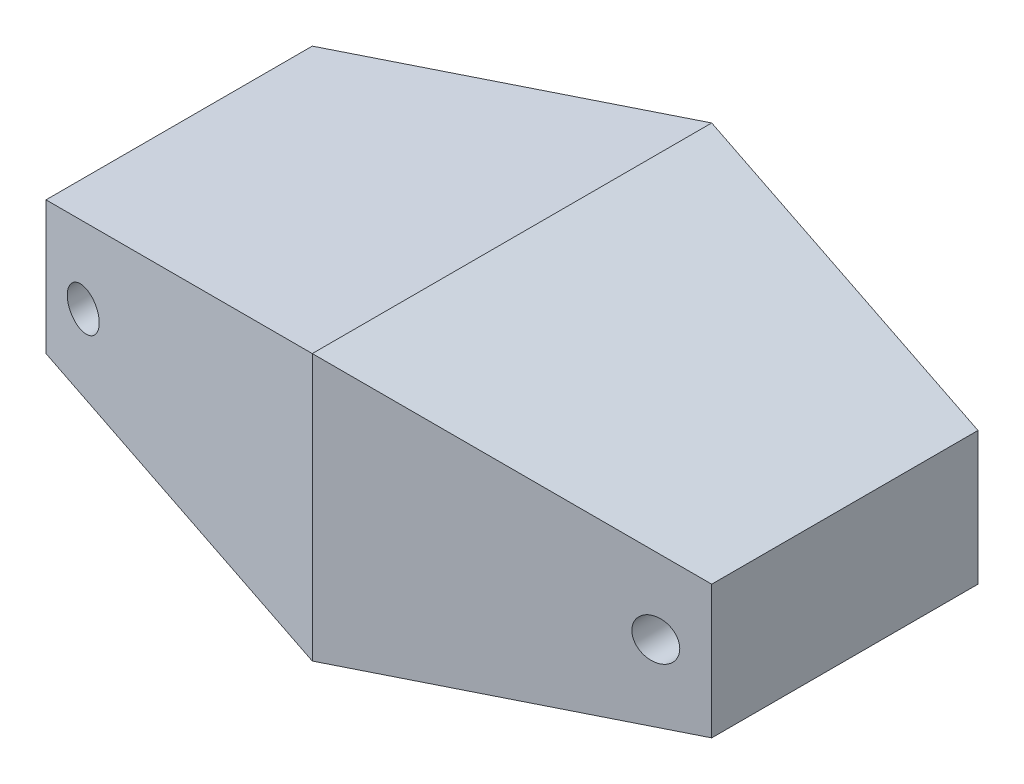
ISO-10303-21;
HEADER;
FILE_DESCRIPTION(('STEP AP214'),'2;1');
FILE_NAME('part.step','',(''),(''),'','','');
FILE_SCHEMA(('AUTOMOTIVE_DESIGN { 1 0 10303 214 1 1 1 1 }'));
ENDSEC;
DATA;
#1=APPLICATION_CONTEXT('core data for automotive mechanical design processes');
#2=APPLICATION_PROTOCOL_DEFINITION('international standard','automotive_design',2000,#1);
#3=PRODUCT_CONTEXT('',#1,'mechanical');
#4=PRODUCT('Part','Part','',(#3));
#5=PRODUCT_RELATED_PRODUCT_CATEGORY('part','',(#4));
#6=PRODUCT_DEFINITION_FORMATION('','',#4);
#7=PRODUCT_DEFINITION_CONTEXT('part definition',#1,'design');
#8=PRODUCT_DEFINITION('design','',#6,#7);
#9=PRODUCT_DEFINITION_SHAPE('','',#8);
#10=(LENGTH_UNIT() NAMED_UNIT(*) SI_UNIT(.MILLI.,.METRE.));
#11=(NAMED_UNIT(*) PLANE_ANGLE_UNIT() SI_UNIT($,.RADIAN.));
#12=(NAMED_UNIT(*) SI_UNIT($,.STERADIAN.) SOLID_ANGLE_UNIT());
#13=UNCERTAINTY_MEASURE_WITH_UNIT(LENGTH_MEASURE(1.E-05),#10,'distance_accuracy_value','');
#14=(GEOMETRIC_REPRESENTATION_CONTEXT(3) GLOBAL_UNCERTAINTY_ASSIGNED_CONTEXT((#13)) GLOBAL_UNIT_ASSIGNED_CONTEXT((#10,
#11,#12)) REPRESENTATION_CONTEXT('',''));
#15=CARTESIAN_POINT('',(0.,0.,0.));
#16=DIRECTION('',(0.,0.,1.));
#17=DIRECTION('',(1.,0.,0.));
#18=AXIS2_PLACEMENT_3D('',#15,#16,#17);
#19=CARTESIAN_POINT('',(50.,-20.,60.));
#20=DIRECTION('',(-1.,0.,0.));
#21=DIRECTION('',(0.,0.,1.));
#22=AXIS2_PLACEMENT_3D('',#19,#20,#21);
#23=PLANE('',#22);
#24=DIRECTION('',(0.,0.,-1.));
#25=VECTOR('',#24,1.);
#26=CARTESIAN_POINT('',(50.0000000000001,9.9999999999999,60.));
#27=LINE('',#26,#25);
#28=CARTESIAN_POINT('',(50.,9.9999999999999,50.));
#29=VERTEX_POINT('',#28);
#30=CARTESIAN_POINT('',(50.0000000000001,9.9999999999999,10.));
#31=VERTEX_POINT('',#30);
#32=EDGE_CURVE('E189',#29,#31,#27,.T.);
#33=ORIENTED_EDGE('',*,*,#32,.F.);
#34=DIRECTION('',(0.,1.,0.));
#35=VECTOR('',#34,1.);
#36=CARTESIAN_POINT('',(50.,-20.,50.));
#37=LINE('',#36,#35);
#38=CARTESIAN_POINT('',(50.0000000000001,-9.9999999999999,50.));
#39=VERTEX_POINT('',#38);
#40=EDGE_CURVE('E146',#39,#29,#37,.T.);
#41=ORIENTED_EDGE('',*,*,#40,.F.);
#42=DIRECTION('',(0.,0.,-1.));
#43=VECTOR('',#42,1.);
#44=CARTESIAN_POINT('',(50.0000000000001,-9.9999999999999,60.));
#45=LINE('',#44,#43);
#46=CARTESIAN_POINT('',(50.,-9.99999999999989,10.));
#47=VERTEX_POINT('',#46);
#48=EDGE_CURVE('E192',#39,#47,#45,.T.);
#49=ORIENTED_EDGE('',*,*,#48,.T.);
#50=DIRECTION('',(0.,1.,0.));
#51=VECTOR('',#50,1.);
#52=CARTESIAN_POINT('',(50.,-20.,10.));
#53=LINE('',#52,#51);
#54=EDGE_CURVE('E165',#47,#31,#53,.T.);
#55=ORIENTED_EDGE('',*,*,#54,.T.);
#56=EDGE_LOOP('',(#33,#41,#49,#55));
#57=FACE_BOUND('',#56,.T.);
#58=ADVANCED_FACE('F74',(#57),#23,.F.);
#59=CARTESIAN_POINT('',(11.5384615384616,-20.,57.6923076923077));
#60=DIRECTION('',(-0.196116135138184,0.,-0.98058067569092));
#61=DIRECTION('',(-0.98058067569092,0.,0.196116135138184));
#62=AXIS2_PLACEMENT_3D('',#59,#60,#61);
#63=PLANE('',#62);
#64=CARTESIAN_POINT('',(43.,0.,51.4));
#65=DIRECTION('',(-0.196116135138184,0.,-0.98058067569092));
#66=DIRECTION('',(0.98058067569092,0.,-0.196116135138184));
#67=AXIS2_PLACEMENT_3D('',#64,#65,#66);
#68=ELLIPSE('',#67,3.05941170815567,3.);
#69=CARTESIAN_POINT('',(46.,0.,50.8));
#70=VERTEX_POINT('',#69);
#71=EDGE_CURVE('E183',#70,#70,#68,.F.);
#72=ORIENTED_EDGE('',*,*,#71,.F.);
#73=EDGE_LOOP('',(#72));
#74=FACE_BOUND('',#73,.T.);
#75=DIRECTION('',(0.962250448649376,-0.192450089729877,-0.192450089729875));
#76=VECTOR('',#75,1.);
#77=CARTESIAN_POINT('',(18.5185185185186,16.2962962962963,56.2962962962963));
#78=LINE('',#77,#76);
#79=CARTESIAN_POINT('',(0.,20.,60.));
#80=VERTEX_POINT('',#79);
#81=EDGE_CURVE('E131',#80,#29,#78,.T.);
#82=ORIENTED_EDGE('',*,*,#81,.F.);
#83=DIRECTION('',(0.,1.,0.));
#84=VECTOR('',#83,1.);
#85=CARTESIAN_POINT('',(0.,-20.,60.));
#86=LINE('',#85,#84);
#87=CARTESIAN_POINT('',(0.,-20.,60.));
#88=VERTEX_POINT('',#87);
#89=EDGE_CURVE('E144',#88,#80,#86,.T.);
#90=ORIENTED_EDGE('',*,*,#89,.F.);
#91=DIRECTION('',(0.962250448649376,0.192450089729877,-0.192450089729875));
#92=VECTOR('',#91,1.);
#93=CARTESIAN_POINT('',(11.1111111111111,-17.7777777777778,57.7777777777778));
#94=LINE('',#93,#92);
#95=EDGE_CURVE('E98',#88,#39,#94,.T.);
#96=ORIENTED_EDGE('',*,*,#95,.T.);
#97=ORIENTED_EDGE('',*,*,#40,.T.);
#98=EDGE_LOOP('',(#82,#90,#96,#97));
#99=FACE_BOUND('',#98,.T.);
#100=ADVANCED_FACE('F142',(#74,#99),#63,.F.);
#101=CARTESIAN_POINT('',(0.,-20.,0.));
#102=DIRECTION('',(0.196116135138184,0.,-0.98058067569092));
#103=DIRECTION('',(-0.98058067569092,0.,-0.196116135138184));
#104=AXIS2_PLACEMENT_3D('',#101,#102,#103);
#105=PLANE('',#104);
#106=CARTESIAN_POINT('',(43.,0.,8.6));
#107=DIRECTION('',(0.196116135138184,0.,-0.98058067569092));
#108=DIRECTION('',(-0.98058067569092,0.,-0.196116135138184));
#109=AXIS2_PLACEMENT_3D('',#106,#107,#108);
#110=ELLIPSE('',#109,3.05941170815567,3.);
#111=CARTESIAN_POINT('',(40.,0.,8.));
#112=VERTEX_POINT('',#111);
#113=EDGE_CURVE('E77',#112,#112,#110,.F.);
#114=ORIENTED_EDGE('',*,*,#113,.T.);
#115=EDGE_LOOP('',(#114));
#116=FACE_BOUND('',#115,.T.);
#117=DIRECTION('',(0.,1.,0.));
#118=VECTOR('',#117,1.);
#119=CARTESIAN_POINT('',(0.,-20.,0.));
#120=LINE('',#119,#118);
#121=CARTESIAN_POINT('',(0.,-20.,0.));
#122=VERTEX_POINT('',#121);
#123=CARTESIAN_POINT('',(0.,20.,0.));
#124=VERTEX_POINT('',#123);
#125=EDGE_CURVE('E216',#122,#124,#120,.T.);
#126=ORIENTED_EDGE('',*,*,#125,.T.);
#127=DIRECTION('',(0.962250448649376,-0.192450089729877,0.192450089729875));
#128=VECTOR('',#127,1.);
#129=CARTESIAN_POINT('',(7.40740740740748,18.5185185185185,1.4814814814815));
#130=LINE('',#129,#128);
#131=EDGE_CURVE('E134',#124,#31,#130,.T.);
#132=ORIENTED_EDGE('',*,*,#131,.T.);
#133=ORIENTED_EDGE('',*,*,#54,.F.);
#134=DIRECTION('',(0.962250448649376,0.192450089729877,0.192450089729875));
#135=VECTOR('',#134,1.);
#136=CARTESIAN_POINT('',(0.,-20.,0.));
#137=LINE('',#136,#135);
#138=EDGE_CURVE('E148',#122,#47,#137,.T.);
#139=ORIENTED_EDGE('',*,*,#138,.F.);
#140=EDGE_LOOP('',(#126,#132,#133,#139));
#141=FACE_BOUND('',#140,.T.);
#142=ADVANCED_FACE('F226',(#116,#141),#105,.T.);
#143=CARTESIAN_POINT('',(-50.,-20.,60.));
#144=DIRECTION('',(1.,0.,0.));
#145=DIRECTION('',(0.,0.,-1.));
#146=AXIS2_PLACEMENT_3D('',#143,#144,#145);
#147=PLANE('',#146);
#148=DIRECTION('',(0.,1.,0.));
#149=VECTOR('',#148,1.);
#150=CARTESIAN_POINT('',(-50.,-20.,50.));
#151=LINE('',#150,#149);
#152=CARTESIAN_POINT('',(-50.,-10.,50.));
#153=VERTEX_POINT('',#152);
#154=CARTESIAN_POINT('',(-50.,10.,50.));
#155=VERTEX_POINT('',#154);
#156=EDGE_CURVE('E157',#153,#155,#151,.T.);
#157=ORIENTED_EDGE('',*,*,#156,.T.);
#158=DIRECTION('',(0.,0.,-1.));
#159=VECTOR('',#158,1.);
#160=CARTESIAN_POINT('',(-50.,10.,60.));
#161=LINE('',#160,#159);
#162=CARTESIAN_POINT('',(-50.,10.,10.));
#163=VERTEX_POINT('',#162);
#164=EDGE_CURVE('E90',#155,#163,#161,.T.);
#165=ORIENTED_EDGE('',*,*,#164,.T.);
#166=DIRECTION('',(0.,1.,0.));
#167=VECTOR('',#166,1.);
#168=CARTESIAN_POINT('',(-50.,-20.,10.));
#169=LINE('',#168,#167);
#170=CARTESIAN_POINT('',(-50.,-10.,10.));
#171=VERTEX_POINT('',#170);
#172=EDGE_CURVE('E162',#171,#163,#169,.T.);
#173=ORIENTED_EDGE('',*,*,#172,.F.);
#174=DIRECTION('',(0.,0.,-1.));
#175=VECTOR('',#174,1.);
#176=CARTESIAN_POINT('',(-50.,-9.99999999999999,60.));
#177=LINE('',#176,#175);
#178=EDGE_CURVE('E137',#153,#171,#177,.T.);
#179=ORIENTED_EDGE('',*,*,#178,.F.);
#180=EDGE_LOOP('',(#157,#165,#173,#179));
#181=FACE_BOUND('',#180,.T.);
#182=ADVANCED_FACE('F235',(#181),#147,.F.);
#183=CARTESIAN_POINT('',(0.,-20.,0.));
#184=DIRECTION('',(0.196116135138184,0.,0.98058067569092));
#185=DIRECTION('',(0.98058067569092,0.,-0.196116135138184));
#186=AXIS2_PLACEMENT_3D('',#183,#184,#185);
#187=PLANE('',#186);
#188=CARTESIAN_POINT('',(-43.,0.,8.60000000000001));
#189=DIRECTION('',(0.196116135138184,0.,0.98058067569092));
#190=DIRECTION('',(0.98058067569092,0.,-0.196116135138184));
#191=AXIS2_PLACEMENT_3D('',#188,#189,#190);
#192=ELLIPSE('',#191,3.05941170815567,3.);
#193=CARTESIAN_POINT('',(-40.,0.,8.00000000000001));
#194=VERTEX_POINT('',#193);
#195=EDGE_CURVE('E173',#194,#194,#192,.F.);
#196=ORIENTED_EDGE('',*,*,#195,.F.);
#197=EDGE_LOOP('',(#196));
#198=FACE_BOUND('',#197,.T.);
#199=ORIENTED_EDGE('',*,*,#172,.T.);
#200=DIRECTION('',(0.962250448649376,0.192450089729875,-0.192450089729876));
#201=VECTOR('',#200,1.);
#202=CARTESIAN_POINT('',(-7.4074074074074,18.5185185185185,1.48148148148148));
#203=LINE('',#202,#201);
#204=EDGE_CURVE('E212',#163,#124,#203,.T.);
#205=ORIENTED_EDGE('',*,*,#204,.T.);
#206=ORIENTED_EDGE('',*,*,#125,.F.);
#207=DIRECTION('',(0.962250448649376,-0.192450089729875,-0.192450089729876));
#208=VECTOR('',#207,1.);
#209=CARTESIAN_POINT('',(0.,-20.,0.));
#210=LINE('',#209,#208);
#211=EDGE_CURVE('E206',#171,#122,#210,.T.);
#212=ORIENTED_EDGE('',*,*,#211,.F.);
#213=EDGE_LOOP('',(#199,#205,#206,#212));
#214=FACE_BOUND('',#213,.T.);
#215=ADVANCED_FACE('F233',(#198,#214),#187,.F.);
#216=CARTESIAN_POINT('',(-11.5384615384615,-20.,57.6923076923077));
#217=DIRECTION('',(-0.196116135138184,0.,0.98058067569092));
#218=DIRECTION('',(0.98058067569092,0.,0.196116135138184));
#219=AXIS2_PLACEMENT_3D('',#216,#217,#218);
#220=PLANE('',#219);
#221=CARTESIAN_POINT('',(-43.,0.,51.4));
#222=DIRECTION('',(-0.196116135138184,0.,0.98058067569092));
#223=DIRECTION('',(-0.98058067569092,0.,-0.196116135138184));
#224=AXIS2_PLACEMENT_3D('',#221,#222,#223);
#225=ELLIPSE('',#224,3.05941170815567,3.);
#226=CARTESIAN_POINT('',(-46.,0.,50.8));
#227=VERTEX_POINT('',#226);
#228=EDGE_CURVE('E170',#227,#227,#225,.F.);
#229=ORIENTED_EDGE('',*,*,#228,.T.);
#230=EDGE_LOOP('',(#229));
#231=FACE_BOUND('',#230,.T.);
#232=DIRECTION('',(0.962250448649376,0.192450089729875,0.192450089729875));
#233=VECTOR('',#232,1.);
#234=CARTESIAN_POINT('',(-18.5185185185185,16.2962962962963,56.2962962962963));
#235=LINE('',#234,#233);
#236=EDGE_CURVE('E12',#155,#80,#235,.T.);
#237=ORIENTED_EDGE('',*,*,#236,.F.);
#238=ORIENTED_EDGE('',*,*,#156,.F.);
#239=DIRECTION('',(0.962250448649376,-0.192450089729875,0.192450089729875));
#240=VECTOR('',#239,1.);
#241=CARTESIAN_POINT('',(-11.1111111111111,-17.7777777777778,57.7777777777778));
#242=LINE('',#241,#240);
#243=EDGE_CURVE('E83',#153,#88,#242,.T.);
#244=ORIENTED_EDGE('',*,*,#243,.T.);
#245=ORIENTED_EDGE('',*,*,#89,.T.);
#246=EDGE_LOOP('',(#237,#238,#244,#245));
#247=FACE_BOUND('',#246,.T.);
#248=ADVANCED_FACE('F155',(#231,#247),#220,.T.);
#249=CARTESIAN_POINT('',(-3.84615384615384,-19.2307692307692,60.));
#250=DIRECTION('',(-0.196116135138184,-0.98058067569092,0.));
#251=DIRECTION('',(0.98058067569092,-0.196116135138184,0.));
#252=AXIS2_PLACEMENT_3D('',#249,#250,#251);
#253=PLANE('',#252);
#254=ORIENTED_EDGE('',*,*,#211,.T.);
#255=DIRECTION('',(0.,0.,-1.));
#256=VECTOR('',#255,1.);
#257=CARTESIAN_POINT('',(0.,-20.,60.));
#258=LINE('',#257,#256);
#259=EDGE_CURVE('E188',#88,#122,#258,.T.);
#260=ORIENTED_EDGE('',*,*,#259,.F.);
#261=ORIENTED_EDGE('',*,*,#243,.F.);
#262=ORIENTED_EDGE('',*,*,#178,.T.);
#263=EDGE_LOOP('',(#254,#260,#261,#262));
#264=FACE_BOUND('',#263,.T.);
#265=ADVANCED_FACE('F229',(#264),#253,.T.);
#266=CARTESIAN_POINT('',(-3.84615384615384,19.2307692307692,60.));
#267=DIRECTION('',(0.196116135138184,-0.98058067569092,0.));
#268=DIRECTION('',(0.98058067569092,0.196116135138184,0.));
#269=AXIS2_PLACEMENT_3D('',#266,#267,#268);
#270=PLANE('',#269);
#271=ORIENTED_EDGE('',*,*,#164,.F.);
#272=ORIENTED_EDGE('',*,*,#236,.T.);
#273=DIRECTION('',(0.,0.,-1.));
#274=VECTOR('',#273,1.);
#275=CARTESIAN_POINT('',(0.,20.,60.));
#276=LINE('',#275,#274);
#277=EDGE_CURVE('E128',#80,#124,#276,.T.);
#278=ORIENTED_EDGE('',*,*,#277,.T.);
#279=ORIENTED_EDGE('',*,*,#204,.F.);
#280=EDGE_LOOP('',(#271,#272,#278,#279));
#281=FACE_BOUND('',#280,.T.);
#282=ADVANCED_FACE('F150',(#281),#270,.F.);
#283=CARTESIAN_POINT('',(3.84615384615389,19.2307692307692,60.));
#284=DIRECTION('',(0.196116135138186,0.98058067569092,0.));
#285=DIRECTION('',(-0.98058067569092,0.196116135138186,0.));
#286=AXIS2_PLACEMENT_3D('',#283,#284,#285);
#287=PLANE('',#286);
#288=ORIENTED_EDGE('',*,*,#81,.T.);
#289=ORIENTED_EDGE('',*,*,#32,.T.);
#290=ORIENTED_EDGE('',*,*,#131,.F.);
#291=ORIENTED_EDGE('',*,*,#277,.F.);
#292=EDGE_LOOP('',(#288,#289,#290,#291));
#293=FACE_BOUND('',#292,.T.);
#294=ADVANCED_FACE('F130',(#293),#287,.T.);
#295=CARTESIAN_POINT('',(3.84615384615388,-19.2307692307692,60.));
#296=DIRECTION('',(-0.196116135138186,0.98058067569092,0.));
#297=DIRECTION('',(-0.98058067569092,-0.196116135138186,0.));
#298=AXIS2_PLACEMENT_3D('',#295,#296,#297);
#299=PLANE('',#298);
#300=ORIENTED_EDGE('',*,*,#259,.T.);
#301=ORIENTED_EDGE('',*,*,#138,.T.);
#302=ORIENTED_EDGE('',*,*,#48,.F.);
#303=ORIENTED_EDGE('',*,*,#95,.F.);
#304=EDGE_LOOP('',(#300,#301,#302,#303));
#305=FACE_BOUND('',#304,.T.);
#306=ADVANCED_FACE('F271',(#305),#299,.F.);
#307=CARTESIAN_POINT('',(-43.,0.,60.));
#308=DIRECTION('',(0.,0.,-1.));
#309=DIRECTION('',(-1.,0.,0.));
#310=AXIS2_PLACEMENT_3D('',#307,#308,#309);
#311=CYLINDRICAL_SURFACE('',#310,3.);
#312=ORIENTED_EDGE('',*,*,#228,.F.);
#313=EDGE_LOOP('',(#312));
#314=FACE_BOUND('',#313,.T.);
#315=ORIENTED_EDGE('',*,*,#195,.T.);
#316=EDGE_LOOP('',(#315));
#317=FACE_BOUND('',#316,.T.);
#318=ADVANCED_FACE('F275',(#314,#317),#311,.F.);
#319=CARTESIAN_POINT('',(43.,0.,60.));
#320=DIRECTION('',(0.,0.,-1.));
#321=DIRECTION('',(-1.,0.,0.));
#322=AXIS2_PLACEMENT_3D('',#319,#320,#321);
#323=CYLINDRICAL_SURFACE('',#322,3.);
#324=ORIENTED_EDGE('',*,*,#113,.F.);
#325=EDGE_LOOP('',(#324));
#326=FACE_BOUND('',#325,.T.);
#327=ORIENTED_EDGE('',*,*,#71,.T.);
#328=EDGE_LOOP('',(#327));
#329=FACE_BOUND('',#328,.T.);
#330=ADVANCED_FACE('F277',(#326,#329),#323,.F.);
#331=CLOSED_SHELL('',(#58,#100,#142,#182,#215,#248,#265,#282,#294,#306,#318,#330));
#332=MANIFOLD_SOLID_BREP('B2',#331);
#333=ADVANCED_BREP_SHAPE_REPRESENTATION('',(#18,#332),#14);
#334=SHAPE_DEFINITION_REPRESENTATION(#9,#333);
ENDSEC;
END-ISO-10303-21;
